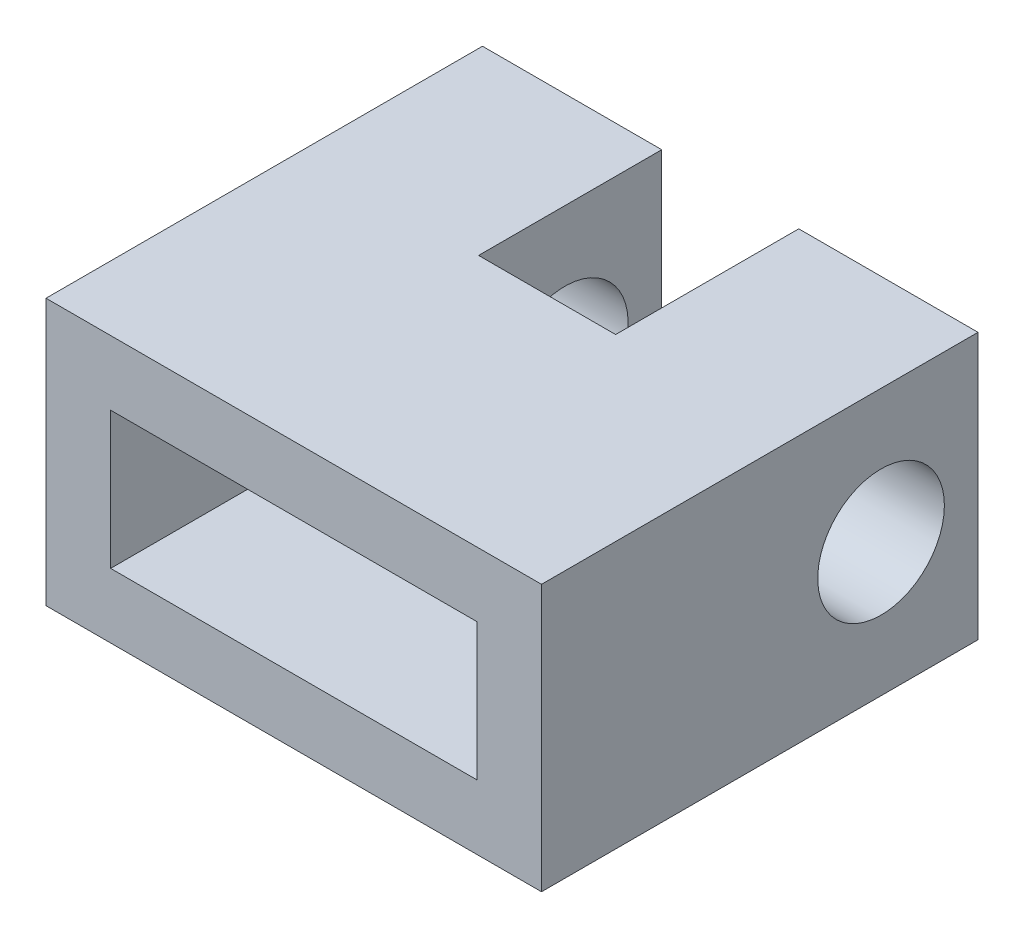
ISO-10303-21;
HEADER;
FILE_DESCRIPTION(('STEP AP214'),'2;1');
FILE_NAME('part.step','',(''),(''),'','','');
FILE_SCHEMA(('AUTOMOTIVE_DESIGN { 1 0 10303 214 1 1 1 1 }'));
ENDSEC;
DATA;
#1=APPLICATION_CONTEXT('core data for automotive mechanical design processes');
#2=APPLICATION_PROTOCOL_DEFINITION('international standard','automotive_design',2000,#1);
#3=PRODUCT_CONTEXT('',#1,'mechanical');
#4=PRODUCT('Part','Part','',(#3));
#5=PRODUCT_RELATED_PRODUCT_CATEGORY('part','',(#4));
#6=PRODUCT_DEFINITION_FORMATION('','',#4);
#7=PRODUCT_DEFINITION_CONTEXT('part definition',#1,'design');
#8=PRODUCT_DEFINITION('design','',#6,#7);
#9=PRODUCT_DEFINITION_SHAPE('','',#8);
#10=(LENGTH_UNIT() NAMED_UNIT(*) SI_UNIT(.MILLI.,.METRE.));
#11=(NAMED_UNIT(*) PLANE_ANGLE_UNIT() SI_UNIT($,.RADIAN.));
#12=(NAMED_UNIT(*) SI_UNIT($,.STERADIAN.) SOLID_ANGLE_UNIT());
#13=UNCERTAINTY_MEASURE_WITH_UNIT(LENGTH_MEASURE(1.E-05),#10,'distance_accuracy_value','');
#14=(GEOMETRIC_REPRESENTATION_CONTEXT(3) GLOBAL_UNCERTAINTY_ASSIGNED_CONTEXT((#13)) GLOBAL_UNIT_ASSIGNED_CONTEXT((#10,
#11,#12)) REPRESENTATION_CONTEXT('',''));
#15=CARTESIAN_POINT('',(0.,0.,0.));
#16=DIRECTION('',(0.,0.,1.));
#17=DIRECTION('',(1.,0.,0.));
#18=AXIS2_PLACEMENT_3D('',#15,#16,#17);
#19=CARTESIAN_POINT('',(0.,0.,-1.));
#20=DIRECTION('',(0.,0.,-1.));
#21=DIRECTION('',(-1.,0.,0.));
#22=AXIS2_PLACEMENT_3D('',#19,#20,#21);
#23=PLANE('',#22);
#24=DIRECTION('',(-1.,0.,0.));
#25=VECTOR('',#24,1.);
#26=CARTESIAN_POINT('',(10.,-1.5,-1.));
#27=LINE('',#26,#25);
#28=CARTESIAN_POINT('',(5.84,-1.5,-1.));
#29=VERTEX_POINT('',#28);
#30=CARTESIAN_POINT('',(2.66,-1.5,-1.));
#31=VERTEX_POINT('',#30);
#32=EDGE_CURVE('E56',#29,#31,#27,.T.);
#33=ORIENTED_EDGE('',*,*,#32,.T.);
#34=DIRECTION('',(0.,-1.,0.));
#35=VECTOR('',#34,1.);
#36=CARTESIAN_POINT('',(2.66,-1.5,-1.));
#37=LINE('',#36,#35);
#38=CARTESIAN_POINT('',(2.66,4.68,-1.));
#39=VERTEX_POINT('',#38);
#40=EDGE_CURVE('E166',#39,#31,#37,.T.);
#41=ORIENTED_EDGE('',*,*,#40,.F.);
#42=DIRECTION('',(1.,0.,0.));
#43=VECTOR('',#42,1.);
#44=CARTESIAN_POINT('',(10.,4.68,-1.));
#45=LINE('',#44,#43);
#46=CARTESIAN_POINT('',(5.84,4.68,-1.));
#47=VERTEX_POINT('',#46);
#48=EDGE_CURVE('E200',#39,#47,#45,.T.);
#49=ORIENTED_EDGE('',*,*,#48,.T.);
#50=DIRECTION('',(0.,1.,0.));
#51=VECTOR('',#50,1.);
#52=CARTESIAN_POINT('',(5.84,4.68,-1.));
#53=LINE('',#52,#51);
#54=EDGE_CURVE('E61',#29,#47,#53,.T.);
#55=ORIENTED_EDGE('',*,*,#54,.F.);
#56=EDGE_LOOP('',(#33,#41,#49,#55));
#57=FACE_BOUND('',#56,.T.);
#58=ADVANCED_FACE('F39',(#57),#23,.T.);
#59=CARTESIAN_POINT('',(0.,0.,4.88));
#60=DIRECTION('',(0.,0.,1.));
#61=DIRECTION('',(1.,0.,0.));
#62=AXIS2_PLACEMENT_3D('',#59,#60,#61);
#63=PLANE('',#62);
#64=DIRECTION('',(0.,-1.,0.));
#65=VECTOR('',#64,1.);
#66=CARTESIAN_POINT('',(-1.5,4.68,4.88));
#67=LINE('',#66,#65);
#68=CARTESIAN_POINT('',(-1.5,4.68,4.88));
#69=VERTEX_POINT('',#68);
#70=CARTESIAN_POINT('',(-1.5,-1.5,4.88));
#71=VERTEX_POINT('',#70);
#72=EDGE_CURVE('E136',#69,#71,#67,.T.);
#73=ORIENTED_EDGE('',*,*,#72,.T.);
#74=DIRECTION('',(1.,0.,0.));
#75=VECTOR('',#74,1.);
#76=CARTESIAN_POINT('',(-1.5,-1.5,4.88));
#77=LINE('',#76,#75);
#78=CARTESIAN_POINT('',(10.,-1.5,4.88));
#79=VERTEX_POINT('',#78);
#80=EDGE_CURVE('E247',#71,#79,#77,.T.);
#81=ORIENTED_EDGE('',*,*,#80,.T.);
#82=DIRECTION('',(0.,1.,0.));
#83=VECTOR('',#82,1.);
#84=CARTESIAN_POINT('',(10.,4.68,4.88));
#85=LINE('',#84,#83);
#86=CARTESIAN_POINT('',(10.,4.68,4.88));
#87=VERTEX_POINT('',#86);
#88=EDGE_CURVE('E250',#79,#87,#85,.T.);
#89=ORIENTED_EDGE('',*,*,#88,.T.);
#90=DIRECTION('',(-1.,0.,0.));
#91=VECTOR('',#90,1.);
#92=CARTESIAN_POINT('',(-1.5,4.68,4.88));
#93=LINE('',#92,#91);
#94=EDGE_CURVE('E141',#87,#69,#93,.T.);
#95=ORIENTED_EDGE('',*,*,#94,.T.);
#96=EDGE_LOOP('',(#73,#81,#89,#95));
#97=FACE_BOUND('',#96,.T.);
#98=DIRECTION('',(1.,0.,0.));
#99=VECTOR('',#98,1.);
#100=CARTESIAN_POINT('',(0.,0.,4.88));
#101=LINE('',#100,#99);
#102=CARTESIAN_POINT('',(0.,0.,4.88));
#103=VERTEX_POINT('',#102);
#104=CARTESIAN_POINT('',(8.5,0.,4.88));
#105=VERTEX_POINT('',#104);
#106=EDGE_CURVE('E207',#103,#105,#101,.T.);
#107=ORIENTED_EDGE('',*,*,#106,.F.);
#108=DIRECTION('',(0.,-1.,0.));
#109=VECTOR('',#108,1.);
#110=CARTESIAN_POINT('',(0.,0.,4.88));
#111=LINE('',#110,#109);
#112=CARTESIAN_POINT('',(0.,3.18,4.88));
#113=VERTEX_POINT('',#112);
#114=EDGE_CURVE('E204',#113,#103,#111,.T.);
#115=ORIENTED_EDGE('',*,*,#114,.F.);
#116=DIRECTION('',(-1.,0.,0.));
#117=VECTOR('',#116,1.);
#118=CARTESIAN_POINT('',(0.,3.18,4.88));
#119=LINE('',#118,#117);
#120=CARTESIAN_POINT('',(8.5,3.18,4.88));
#121=VERTEX_POINT('',#120);
#122=EDGE_CURVE('E215',#121,#113,#119,.T.);
#123=ORIENTED_EDGE('',*,*,#122,.F.);
#124=DIRECTION('',(0.,1.,0.));
#125=VECTOR('',#124,1.);
#126=CARTESIAN_POINT('',(8.5,0.,4.88));
#127=LINE('',#126,#125);
#128=EDGE_CURVE('E211',#105,#121,#127,.T.);
#129=ORIENTED_EDGE('',*,*,#128,.F.);
#130=EDGE_LOOP('',(#107,#115,#123,#129));
#131=FACE_BOUND('',#130,.T.);
#132=ADVANCED_FACE('F272',(#97,#131),#63,.T.);
#133=CARTESIAN_POINT('',(-1.5,4.68,4.88));
#134=DIRECTION('',(1.,0.,0.));
#135=DIRECTION('',(0.,1.,0.));
#136=AXIS2_PLACEMENT_3D('',#133,#134,#135);
#137=PLANE('',#136);
#138=CARTESIAN_POINT('',(-1.5,1.59,-3.00000000000003));
#139=DIRECTION('',(-1.,0.,0.));
#140=DIRECTION('',(0.,-1.,0.));
#141=AXIS2_PLACEMENT_3D('',#138,#139,#140);
#142=CIRCLE('',#141,1.47);
#143=CARTESIAN_POINT('',(-1.5,0.12,-3.00000000000003));
#144=VERTEX_POINT('',#143);
#145=EDGE_CURVE('E287',#144,#144,#142,.T.);
#146=ORIENTED_EDGE('',*,*,#145,.F.);
#147=EDGE_LOOP('',(#146));
#148=FACE_BOUND('',#147,.T.);
#149=DIRECTION('',(0.,0.,-1.));
#150=VECTOR('',#149,1.);
#151=CARTESIAN_POINT('',(-1.5,4.68,4.88));
#152=LINE('',#151,#150);
#153=CARTESIAN_POINT('',(-1.5,4.68,-5.25000000000005));
#154=VERTEX_POINT('',#153);
#155=EDGE_CURVE('E129',#69,#154,#152,.T.);
#156=ORIENTED_EDGE('',*,*,#155,.T.);
#157=DIRECTION('',(0.,1.,0.));
#158=VECTOR('',#157,1.);
#159=CARTESIAN_POINT('',(-1.5,-1.5,-5.25000000000005));
#160=LINE('',#159,#158);
#161=CARTESIAN_POINT('',(-1.5,-1.5,-5.25000000000005));
#162=VERTEX_POINT('',#161);
#163=EDGE_CURVE('E133',#162,#154,#160,.T.);
#164=ORIENTED_EDGE('',*,*,#163,.F.);
#165=DIRECTION('',(0.,0.,-1.));
#166=VECTOR('',#165,1.);
#167=CARTESIAN_POINT('',(-1.5,-1.5,4.88));
#168=LINE('',#167,#166);
#169=EDGE_CURVE('E11',#71,#162,#168,.T.);
#170=ORIENTED_EDGE('',*,*,#169,.F.);
#171=ORIENTED_EDGE('',*,*,#72,.F.);
#172=EDGE_LOOP('',(#156,#164,#170,#171));
#173=FACE_BOUND('',#172,.T.);
#174=ADVANCED_FACE('F41',(#148,#173),#137,.F.);
#175=CARTESIAN_POINT('',(-1.5,-1.5,4.88));
#176=DIRECTION('',(0.,1.,0.));
#177=DIRECTION('',(0.,0.,1.));
#178=AXIS2_PLACEMENT_3D('',#175,#176,#177);
#179=PLANE('',#178);
#180=ORIENTED_EDGE('',*,*,#169,.T.);
#181=DIRECTION('',(-1.,0.,0.));
#182=VECTOR('',#181,1.);
#183=CARTESIAN_POINT('',(2.66,-1.5,-5.25000000000005));
#184=LINE('',#183,#182);
#185=CARTESIAN_POINT('',(2.66,-1.5,-5.25000000000005));
#186=VERTEX_POINT('',#185);
#187=EDGE_CURVE('E156',#186,#162,#184,.T.);
#188=ORIENTED_EDGE('',*,*,#187,.F.);
#189=DIRECTION('',(0.,0.,1.));
#190=VECTOR('',#189,1.);
#191=CARTESIAN_POINT('',(2.66,-1.5,-12.6996979804554));
#192=LINE('',#191,#190);
#193=EDGE_CURVE('E153',#186,#31,#192,.T.);
#194=ORIENTED_EDGE('',*,*,#193,.T.);
#195=ORIENTED_EDGE('',*,*,#32,.F.);
#196=DIRECTION('',(0.,0.,1.));
#197=VECTOR('',#196,1.);
#198=CARTESIAN_POINT('',(5.84,-1.5,-12.6996979804554));
#199=LINE('',#198,#197);
#200=CARTESIAN_POINT('',(5.84,-1.5,-5.25000000000005));
#201=VERTEX_POINT('',#200);
#202=EDGE_CURVE('E158',#201,#29,#199,.T.);
#203=ORIENTED_EDGE('',*,*,#202,.F.);
#204=DIRECTION('',(-1.,0.,0.));
#205=VECTOR('',#204,1.);
#206=CARTESIAN_POINT('',(10.,-1.5,-5.25000000000005));
#207=LINE('',#206,#205);
#208=CARTESIAN_POINT('',(10.,-1.5,-5.25000000000005));
#209=VERTEX_POINT('',#208);
#210=EDGE_CURVE('E183',#209,#201,#207,.T.);
#211=ORIENTED_EDGE('',*,*,#210,.F.);
#212=DIRECTION('',(0.,0.,-1.));
#213=VECTOR('',#212,1.);
#214=CARTESIAN_POINT('',(10.,-1.5,4.88));
#215=LINE('',#214,#213);
#216=EDGE_CURVE('E49',#79,#209,#215,.T.);
#217=ORIENTED_EDGE('',*,*,#216,.F.);
#218=ORIENTED_EDGE('',*,*,#80,.F.);
#219=EDGE_LOOP('',(#180,#188,#194,#195,#203,#211,#217,#218));
#220=FACE_BOUND('',#219,.T.);
#221=ADVANCED_FACE('F267',(#220),#179,.F.);
#222=CARTESIAN_POINT('',(10.,4.68,4.88));
#223=DIRECTION('',(-1.,0.,0.));
#224=DIRECTION('',(0.,0.,1.));
#225=AXIS2_PLACEMENT_3D('',#222,#223,#224);
#226=PLANE('',#225);
#227=CARTESIAN_POINT('',(10.,1.59,-3.00000000000007));
#228=DIRECTION('',(1.,0.,0.));
#229=DIRECTION('',(0.,0.,-1.));
#230=AXIS2_PLACEMENT_3D('',#227,#228,#229);
#231=CIRCLE('',#230,1.47);
#232=CARTESIAN_POINT('',(10.,1.59,-4.47000000000007));
#233=VERTEX_POINT('',#232);
#234=EDGE_CURVE('E284',#233,#233,#231,.T.);
#235=ORIENTED_EDGE('',*,*,#234,.F.);
#236=EDGE_LOOP('',(#235));
#237=FACE_BOUND('',#236,.T.);
#238=ORIENTED_EDGE('',*,*,#216,.T.);
#239=DIRECTION('',(0.,-1.,0.));
#240=VECTOR('',#239,1.);
#241=CARTESIAN_POINT('',(10.,4.68,-5.25000000000005));
#242=LINE('',#241,#240);
#243=CARTESIAN_POINT('',(10.,4.68,-5.25000000000005));
#244=VERTEX_POINT('',#243);
#245=EDGE_CURVE('E187',#244,#209,#242,.T.);
#246=ORIENTED_EDGE('',*,*,#245,.F.);
#247=DIRECTION('',(0.,0.,-1.));
#248=VECTOR('',#247,1.);
#249=CARTESIAN_POINT('',(10.,4.68,4.88));
#250=LINE('',#249,#248);
#251=EDGE_CURVE('E140',#87,#244,#250,.T.);
#252=ORIENTED_EDGE('',*,*,#251,.F.);
#253=ORIENTED_EDGE('',*,*,#88,.F.);
#254=EDGE_LOOP('',(#238,#246,#252,#253));
#255=FACE_BOUND('',#254,.T.);
#256=ADVANCED_FACE('F263',(#237,#255),#226,.F.);
#257=CARTESIAN_POINT('',(-1.5,4.68,4.88));
#258=DIRECTION('',(0.,-1.,0.));
#259=DIRECTION('',(0.,0.,-1.));
#260=AXIS2_PLACEMENT_3D('',#257,#258,#259);
#261=PLANE('',#260);
#262=ORIENTED_EDGE('',*,*,#251,.T.);
#263=DIRECTION('',(1.,0.,0.));
#264=VECTOR('',#263,1.);
#265=CARTESIAN_POINT('',(10.,4.68,-5.25000000000005));
#266=LINE('',#265,#264);
#267=CARTESIAN_POINT('',(5.84,4.68,-5.25000000000005));
#268=VERTEX_POINT('',#267);
#269=EDGE_CURVE('E191',#268,#244,#266,.T.);
#270=ORIENTED_EDGE('',*,*,#269,.F.);
#271=DIRECTION('',(0.,0.,1.));
#272=VECTOR('',#271,1.);
#273=CARTESIAN_POINT('',(5.84,4.68,-12.6996979804554));
#274=LINE('',#273,#272);
#275=EDGE_CURVE('E178',#268,#47,#274,.T.);
#276=ORIENTED_EDGE('',*,*,#275,.T.);
#277=ORIENTED_EDGE('',*,*,#48,.F.);
#278=DIRECTION('',(0.,0.,1.));
#279=VECTOR('',#278,1.);
#280=CARTESIAN_POINT('',(2.66,4.68,-12.6996979804554));
#281=LINE('',#280,#279);
#282=CARTESIAN_POINT('',(2.66,4.68,-5.25000000000005));
#283=VERTEX_POINT('',#282);
#284=EDGE_CURVE('E147',#283,#39,#281,.T.);
#285=ORIENTED_EDGE('',*,*,#284,.F.);
#286=DIRECTION('',(1.,0.,0.));
#287=VECTOR('',#286,1.);
#288=CARTESIAN_POINT('',(2.66,4.68,-5.25000000000005));
#289=LINE('',#288,#287);
#290=EDGE_CURVE('E144',#154,#283,#289,.T.);
#291=ORIENTED_EDGE('',*,*,#290,.F.);
#292=ORIENTED_EDGE('',*,*,#155,.F.);
#293=ORIENTED_EDGE('',*,*,#94,.F.);
#294=EDGE_LOOP('',(#262,#270,#276,#277,#285,#291,#292,#293));
#295=FACE_BOUND('',#294,.T.);
#296=ADVANCED_FACE('F145',(#295),#261,.F.);
#297=CARTESIAN_POINT('',(0.,0.,4.88));
#298=DIRECTION('',(1.,0.,0.));
#299=DIRECTION('',(0.,0.,-1.));
#300=AXIS2_PLACEMENT_3D('',#297,#298,#299);
#301=PLANE('',#300);
#302=DIRECTION('',(0.,-1.,0.));
#303=VECTOR('',#302,1.);
#304=CARTESIAN_POINT('',(0.,0.,0.));
#305=LINE('',#304,#303);
#306=CARTESIAN_POINT('',(0.,3.18,0.));
#307=VERTEX_POINT('',#306);
#308=CARTESIAN_POINT('',(0.,0.,0.));
#309=VERTEX_POINT('',#308);
#310=EDGE_CURVE('E203',#307,#309,#305,.T.);
#311=ORIENTED_EDGE('',*,*,#310,.F.);
#312=DIRECTION('',(0.,0.,-1.));
#313=VECTOR('',#312,1.);
#314=CARTESIAN_POINT('',(0.,3.18,4.88));
#315=LINE('',#314,#313);
#316=EDGE_CURVE('E218',#113,#307,#315,.T.);
#317=ORIENTED_EDGE('',*,*,#316,.F.);
#318=ORIENTED_EDGE('',*,*,#114,.T.);
#319=DIRECTION('',(0.,0.,-1.));
#320=VECTOR('',#319,1.);
#321=CARTESIAN_POINT('',(0.,0.,4.88));
#322=LINE('',#321,#320);
#323=EDGE_CURVE('E241',#103,#309,#322,.T.);
#324=ORIENTED_EDGE('',*,*,#323,.T.);
#325=EDGE_LOOP('',(#311,#317,#318,#324));
#326=FACE_BOUND('',#325,.T.);
#327=ADVANCED_FACE('F324',(#326),#301,.T.);
#328=CARTESIAN_POINT('',(0.,0.,4.88));
#329=DIRECTION('',(0.,1.,0.));
#330=DIRECTION('',(0.,0.,1.));
#331=AXIS2_PLACEMENT_3D('',#328,#329,#330);
#332=PLANE('',#331);
#333=DIRECTION('',(1.,0.,0.));
#334=VECTOR('',#333,1.);
#335=CARTESIAN_POINT('',(0.,0.,0.));
#336=LINE('',#335,#334);
#337=CARTESIAN_POINT('',(8.5,0.,0.));
#338=VERTEX_POINT('',#337);
#339=EDGE_CURVE('E222',#309,#338,#336,.T.);
#340=ORIENTED_EDGE('',*,*,#339,.F.);
#341=ORIENTED_EDGE('',*,*,#323,.F.);
#342=ORIENTED_EDGE('',*,*,#106,.T.);
#343=DIRECTION('',(0.,0.,-1.));
#344=VECTOR('',#343,1.);
#345=CARTESIAN_POINT('',(8.5,0.,4.88));
#346=LINE('',#345,#344);
#347=EDGE_CURVE('E238',#105,#338,#346,.T.);
#348=ORIENTED_EDGE('',*,*,#347,.T.);
#349=EDGE_LOOP('',(#340,#341,#342,#348));
#350=FACE_BOUND('',#349,.T.);
#351=ADVANCED_FACE('F320',(#350),#332,.T.);
#352=CARTESIAN_POINT('',(8.5,0.,4.88));
#353=DIRECTION('',(-1.,0.,0.));
#354=DIRECTION('',(0.,0.,1.));
#355=AXIS2_PLACEMENT_3D('',#352,#353,#354);
#356=PLANE('',#355);
#357=DIRECTION('',(0.,1.,0.));
#358=VECTOR('',#357,1.);
#359=CARTESIAN_POINT('',(8.5,0.,0.));
#360=LINE('',#359,#358);
#361=CARTESIAN_POINT('',(8.5,3.18,0.));
#362=VERTEX_POINT('',#361);
#363=EDGE_CURVE('E226',#338,#362,#360,.T.);
#364=ORIENTED_EDGE('',*,*,#363,.F.);
#365=ORIENTED_EDGE('',*,*,#347,.F.);
#366=ORIENTED_EDGE('',*,*,#128,.T.);
#367=DIRECTION('',(0.,0.,-1.));
#368=VECTOR('',#367,1.);
#369=CARTESIAN_POINT('',(8.5,3.18,4.88));
#370=LINE('',#369,#368);
#371=EDGE_CURVE('E235',#121,#362,#370,.T.);
#372=ORIENTED_EDGE('',*,*,#371,.T.);
#373=EDGE_LOOP('',(#364,#365,#366,#372));
#374=FACE_BOUND('',#373,.T.);
#375=ADVANCED_FACE('F316',(#374),#356,.T.);
#376=CARTESIAN_POINT('',(0.,3.18,4.88));
#377=DIRECTION('',(0.,-1.,0.));
#378=DIRECTION('',(0.,0.,-1.));
#379=AXIS2_PLACEMENT_3D('',#376,#377,#378);
#380=PLANE('',#379);
#381=DIRECTION('',(-1.,0.,0.));
#382=VECTOR('',#381,1.);
#383=CARTESIAN_POINT('',(0.,3.18,0.));
#384=LINE('',#383,#382);
#385=EDGE_CURVE('E208',#362,#307,#384,.T.);
#386=ORIENTED_EDGE('',*,*,#385,.F.);
#387=ORIENTED_EDGE('',*,*,#371,.F.);
#388=ORIENTED_EDGE('',*,*,#122,.T.);
#389=ORIENTED_EDGE('',*,*,#316,.T.);
#390=EDGE_LOOP('',(#386,#387,#388,#389));
#391=FACE_BOUND('',#390,.T.);
#392=ADVANCED_FACE('F312',(#391),#380,.T.);
#393=CARTESIAN_POINT('',(0.,0.,0.));
#394=DIRECTION('',(0.,0.,-1.));
#395=DIRECTION('',(-1.,0.,0.));
#396=AXIS2_PLACEMENT_3D('',#393,#394,#395);
#397=PLANE('',#396);
#398=ORIENTED_EDGE('',*,*,#385,.T.);
#399=ORIENTED_EDGE('',*,*,#310,.T.);
#400=ORIENTED_EDGE('',*,*,#339,.T.);
#401=ORIENTED_EDGE('',*,*,#363,.T.);
#402=EDGE_LOOP('',(#398,#399,#400,#401));
#403=FACE_BOUND('',#402,.T.);
#404=ADVANCED_FACE('F308',(#403),#397,.F.);
#405=CARTESIAN_POINT('',(5.84,4.68,-12.6996979804554));
#406=DIRECTION('',(1.,0.,0.));
#407=DIRECTION('',(0.,0.,-1.));
#408=AXIS2_PLACEMENT_3D('',#405,#406,#407);
#409=PLANE('',#408);
#410=CARTESIAN_POINT('',(5.84,1.59,-3.00000000000007));
#411=DIRECTION('',(1.,0.,0.));
#412=DIRECTION('',(0.,0.,-1.));
#413=AXIS2_PLACEMENT_3D('',#410,#411,#412);
#414=CIRCLE('',#413,1.47);
#415=CARTESIAN_POINT('',(5.84,1.59,-4.47000000000007));
#416=VERTEX_POINT('',#415);
#417=EDGE_CURVE('E175',#416,#416,#414,.T.);
#418=ORIENTED_EDGE('',*,*,#417,.T.);
#419=EDGE_LOOP('',(#418));
#420=FACE_BOUND('',#419,.T.);
#421=DIRECTION('',(0.,1.,0.));
#422=VECTOR('',#421,1.);
#423=CARTESIAN_POINT('',(5.84,4.68,-5.25000000000005));
#424=LINE('',#423,#422);
#425=EDGE_CURVE('E179',#201,#268,#424,.T.);
#426=ORIENTED_EDGE('',*,*,#425,.F.);
#427=ORIENTED_EDGE('',*,*,#202,.T.);
#428=ORIENTED_EDGE('',*,*,#54,.T.);
#429=ORIENTED_EDGE('',*,*,#275,.F.);
#430=EDGE_LOOP('',(#426,#427,#428,#429));
#431=FACE_BOUND('',#430,.T.);
#432=ADVANCED_FACE('F311',(#420,#431),#409,.F.);
#433=CARTESIAN_POINT('',(7.8400000000005,0.568899999999829,-5.25000000000005));
#434=DIRECTION('',(0.,0.,-1.));
#435=DIRECTION('',(0.,1.,0.));
#436=AXIS2_PLACEMENT_3D('',#433,#434,#435);
#437=PLANE('',#436);
#438=ORIENTED_EDGE('',*,*,#269,.T.);
#439=ORIENTED_EDGE('',*,*,#245,.T.);
#440=ORIENTED_EDGE('',*,*,#210,.T.);
#441=ORIENTED_EDGE('',*,*,#425,.T.);
#442=EDGE_LOOP('',(#438,#439,#440,#441));
#443=FACE_BOUND('',#442,.T.);
#444=ADVANCED_FACE('F269',(#443),#437,.T.);
#445=CARTESIAN_POINT('',(2.66,-1.5,-12.6996979804554));
#446=DIRECTION('',(-1.,0.,0.));
#447=DIRECTION('',(0.,0.,1.));
#448=AXIS2_PLACEMENT_3D('',#445,#446,#447);
#449=PLANE('',#448);
#450=CARTESIAN_POINT('',(2.66,1.59,-3.00000000000007));
#451=DIRECTION('',(-1.,0.,0.));
#452=DIRECTION('',(0.,0.,1.));
#453=AXIS2_PLACEMENT_3D('',#450,#451,#452);
#454=CIRCLE('',#453,1.47);
#455=CARTESIAN_POINT('',(2.66,1.59,-1.53000000000007));
#456=VERTEX_POINT('',#455);
#457=EDGE_CURVE('E43',#456,#456,#454,.T.);
#458=ORIENTED_EDGE('',*,*,#457,.T.);
#459=EDGE_LOOP('',(#458));
#460=FACE_BOUND('',#459,.T.);
#461=DIRECTION('',(0.,-1.,0.));
#462=VECTOR('',#461,1.);
#463=CARTESIAN_POINT('',(2.66,-1.5,-5.25000000000005));
#464=LINE('',#463,#462);
#465=EDGE_CURVE('E152',#283,#186,#464,.T.);
#466=ORIENTED_EDGE('',*,*,#465,.F.);
#467=ORIENTED_EDGE('',*,*,#284,.T.);
#468=ORIENTED_EDGE('',*,*,#40,.T.);
#469=ORIENTED_EDGE('',*,*,#193,.F.);
#470=EDGE_LOOP('',(#466,#467,#468,#469));
#471=FACE_BOUND('',#470,.T.);
#472=ADVANCED_FACE('F277',(#460,#471),#449,.F.);
#473=CARTESIAN_POINT('',(7.8400000000005,0.568899999999829,-5.25000000000005));
#474=DIRECTION('',(0.,0.,-1.));
#475=DIRECTION('',(0.,1.,0.));
#476=AXIS2_PLACEMENT_3D('',#473,#474,#475);
#477=PLANE('',#476);
#478=ORIENTED_EDGE('',*,*,#290,.T.);
#479=ORIENTED_EDGE('',*,*,#465,.T.);
#480=ORIENTED_EDGE('',*,*,#187,.T.);
#481=ORIENTED_EDGE('',*,*,#163,.T.);
#482=EDGE_LOOP('',(#478,#479,#480,#481));
#483=FACE_BOUND('',#482,.T.);
#484=ADVANCED_FACE('F155',(#483),#477,.T.);
#485=CARTESIAN_POINT('',(2.5,1.59,-3.00000000000007));
#486=DIRECTION('',(1.,0.,0.));
#487=DIRECTION('',(0.,0.,-1.));
#488=AXIS2_PLACEMENT_3D('',#485,#486,#487);
#489=CYLINDRICAL_SURFACE('',#488,1.47);
#490=ORIENTED_EDGE('',*,*,#457,.F.);
#491=EDGE_LOOP('',(#490));
#492=FACE_BOUND('',#491,.T.);
#493=ORIENTED_EDGE('',*,*,#145,.T.);
#494=EDGE_LOOP('',(#493));
#495=FACE_BOUND('',#494,.T.);
#496=ADVANCED_FACE('F293',(#492,#495),#489,.F.);
#497=ORIENTED_EDGE('',*,*,#234,.T.);
#498=EDGE_LOOP('',(#497));
#499=FACE_BOUND('',#498,.T.);
#500=ORIENTED_EDGE('',*,*,#417,.F.);
#501=EDGE_LOOP('',(#500));
#502=FACE_BOUND('',#501,.T.);
#503=ADVANCED_FACE('F337',(#499,#502),#489,.F.);
#504=CLOSED_SHELL('',(#58,#132,#174,#221,#256,#296,#327,#351,#375,#392,#404,#432,#444,#472,#484,
#496,#503));
#505=MANIFOLD_SOLID_BREP('B2',#504);
#506=ADVANCED_BREP_SHAPE_REPRESENTATION('',(#18,#505),#14);
#507=SHAPE_DEFINITION_REPRESENTATION(#9,#506);
ENDSEC;
END-ISO-10303-21;
